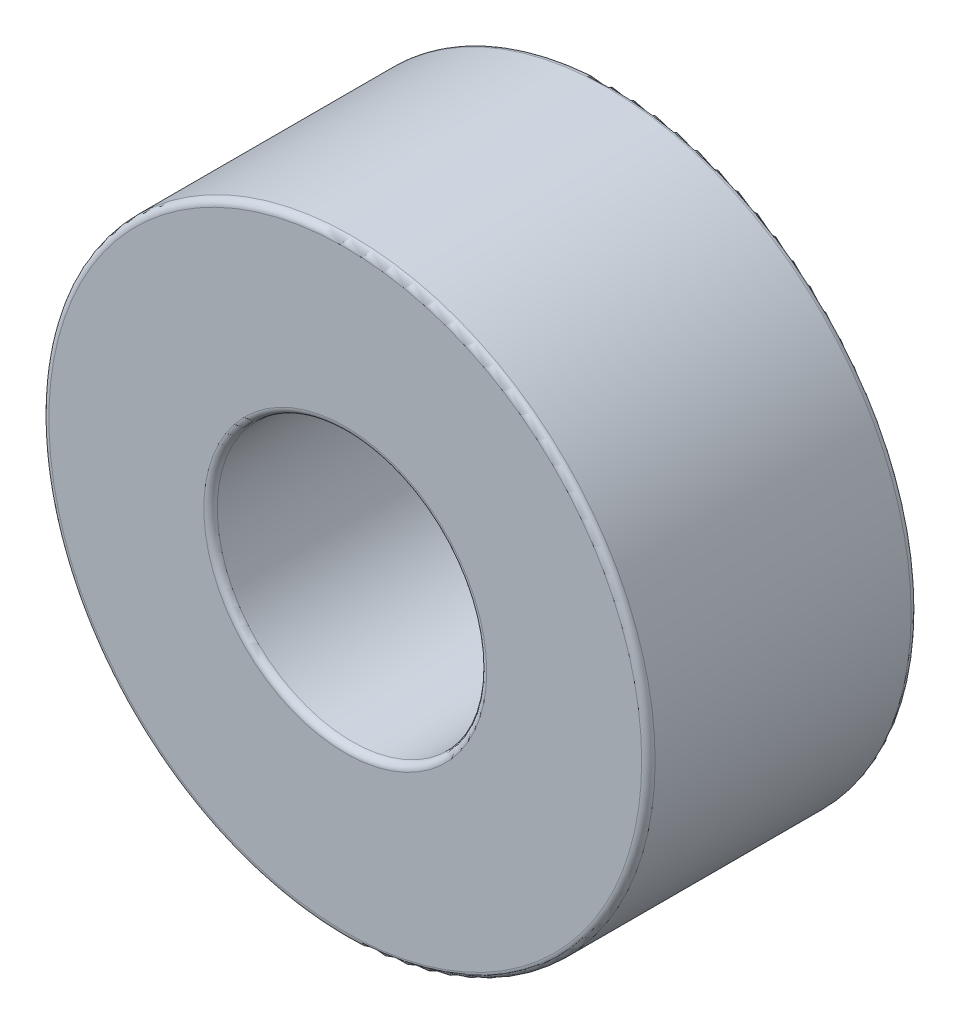
ISO-10303-21;
HEADER;
FILE_DESCRIPTION(('STEP AP214'),'2;1');
FILE_NAME('part.step','',(''),(''),'','','');
FILE_SCHEMA(('AUTOMOTIVE_DESIGN { 1 0 10303 214 1 1 1 1 }'));
ENDSEC;
DATA;
#1=APPLICATION_CONTEXT('core data for automotive mechanical design processes');
#2=APPLICATION_PROTOCOL_DEFINITION('international standard','automotive_design',2000,#1);
#3=PRODUCT_CONTEXT('',#1,'mechanical');
#4=PRODUCT('Part','Part','',(#3));
#5=PRODUCT_RELATED_PRODUCT_CATEGORY('part','',(#4));
#6=PRODUCT_DEFINITION_FORMATION('','',#4);
#7=PRODUCT_DEFINITION_CONTEXT('part definition',#1,'design');
#8=PRODUCT_DEFINITION('design','',#6,#7);
#9=PRODUCT_DEFINITION_SHAPE('','',#8);
#10=(LENGTH_UNIT() NAMED_UNIT(*) SI_UNIT(.MILLI.,.METRE.));
#11=(NAMED_UNIT(*) PLANE_ANGLE_UNIT() SI_UNIT($,.RADIAN.));
#12=(NAMED_UNIT(*) SI_UNIT($,.STERADIAN.) SOLID_ANGLE_UNIT());
#13=UNCERTAINTY_MEASURE_WITH_UNIT(LENGTH_MEASURE(1.E-05),#10,'distance_accuracy_value','');
#14=(GEOMETRIC_REPRESENTATION_CONTEXT(3) GLOBAL_UNCERTAINTY_ASSIGNED_CONTEXT((#13)) GLOBAL_UNIT_ASSIGNED_CONTEXT((#10,
#11,#12)) REPRESENTATION_CONTEXT('',''));
#15=CARTESIAN_POINT('',(0.,0.,0.));
#16=DIRECTION('',(0.,0.,1.));
#17=DIRECTION('',(1.,0.,0.));
#18=AXIS2_PLACEMENT_3D('',#15,#16,#17);
#19=CARTESIAN_POINT('',(0.,0.,4.));
#20=DIRECTION('',(0.,0.,1.));
#21=DIRECTION('',(1.,0.,0.));
#22=AXIS2_PLACEMENT_3D('',#19,#20,#21);
#23=PLANE('',#22);
#24=CARTESIAN_POINT('',(0.,0.,4.));
#25=DIRECTION('',(0.,0.,1.));
#26=DIRECTION('',(1.,0.,0.));
#27=AXIS2_PLACEMENT_3D('',#24,#25,#26);
#28=CIRCLE('',#27,2.1);
#29=CARTESIAN_POINT('',(2.1,0.,4.));
#30=VERTEX_POINT('',#29);
#31=EDGE_CURVE('E10',#30,#30,#28,.F.);
#32=ORIENTED_EDGE('',*,*,#31,.T.);
#33=EDGE_LOOP('',(#32));
#34=FACE_BOUND('',#33,.T.);
#35=CARTESIAN_POINT('',(0.,0.,4.));
#36=DIRECTION('',(0.,0.,1.));
#37=DIRECTION('',(1.,0.,0.));
#38=AXIS2_PLACEMENT_3D('',#35,#36,#37);
#39=CIRCLE('',#38,4.4);
#40=CARTESIAN_POINT('',(4.4,0.,4.));
#41=VERTEX_POINT('',#40);
#42=EDGE_CURVE('E38',#41,#41,#39,.T.);
#43=ORIENTED_EDGE('',*,*,#42,.T.);
#44=EDGE_LOOP('',(#43));
#45=FACE_BOUND('',#44,.T.);
#46=ADVANCED_FACE('F31',(#34,#45),#23,.T.);
#47=CARTESIAN_POINT('',(0.,0.,0.));
#48=DIRECTION('',(0.,0.,1.));
#49=DIRECTION('',(1.,0.,0.));
#50=AXIS2_PLACEMENT_3D('',#47,#48,#49);
#51=PLANE('',#50);
#52=CARTESIAN_POINT('',(0.,0.,0.));
#53=DIRECTION('',(0.,0.,1.));
#54=DIRECTION('',(1.,0.,0.));
#55=AXIS2_PLACEMENT_3D('',#52,#53,#54);
#56=CIRCLE('',#55,2.1);
#57=CARTESIAN_POINT('',(2.1,0.,0.));
#58=VERTEX_POINT('',#57);
#59=EDGE_CURVE('E57',#58,#58,#56,.T.);
#60=ORIENTED_EDGE('',*,*,#59,.T.);
#61=EDGE_LOOP('',(#60));
#62=FACE_BOUND('',#61,.T.);
#63=CARTESIAN_POINT('',(0.,0.,0.));
#64=DIRECTION('',(0.,0.,1.));
#65=DIRECTION('',(1.,0.,0.));
#66=AXIS2_PLACEMENT_3D('',#63,#64,#65);
#67=CIRCLE('',#66,4.4);
#68=CARTESIAN_POINT('',(4.4,0.,0.));
#69=VERTEX_POINT('',#68);
#70=EDGE_CURVE('E60',#69,#69,#67,.F.);
#71=ORIENTED_EDGE('',*,*,#70,.T.);
#72=EDGE_LOOP('',(#71));
#73=FACE_BOUND('',#72,.T.);
#74=ADVANCED_FACE('F64',(#62,#73),#51,.F.);
#75=CARTESIAN_POINT('',(0.,0.,4.));
#76=DIRECTION('',(0.,0.,-1.));
#77=DIRECTION('',(-1.,0.,0.));
#78=AXIS2_PLACEMENT_3D('',#75,#76,#77);
#79=CYLINDRICAL_SURFACE('',#78,4.5);
#80=CARTESIAN_POINT('',(0.,0.,0.0999999999999998));
#81=DIRECTION('',(0.,0.,1.));
#82=DIRECTION('',(1.,0.,0.));
#83=AXIS2_PLACEMENT_3D('',#80,#81,#82);
#84=CIRCLE('',#83,4.5);
#85=CARTESIAN_POINT('',(4.5,0.,0.0999999999999998));
#86=VERTEX_POINT('',#85);
#87=EDGE_CURVE('E42',#86,#86,#84,.T.);
#88=ORIENTED_EDGE('',*,*,#87,.T.);
#89=EDGE_LOOP('',(#88));
#90=FACE_BOUND('',#89,.T.);
#91=CARTESIAN_POINT('',(0.,0.,3.9));
#92=DIRECTION('',(0.,0.,1.));
#93=DIRECTION('',(1.,0.,0.));
#94=AXIS2_PLACEMENT_3D('',#91,#92,#93);
#95=CIRCLE('',#94,4.5);
#96=CARTESIAN_POINT('',(4.5,0.,3.9));
#97=VERTEX_POINT('',#96);
#98=EDGE_CURVE('E46',#97,#97,#95,.F.);
#99=ORIENTED_EDGE('',*,*,#98,.T.);
#100=EDGE_LOOP('',(#99));
#101=FACE_BOUND('',#100,.T.);
#102=ADVANCED_FACE('F74',(#90,#101),#79,.T.);
#103=CARTESIAN_POINT('',(0.,0.,4.));
#104=DIRECTION('',(0.,0.,-1.));
#105=DIRECTION('',(-1.,0.,0.));
#106=AXIS2_PLACEMENT_3D('',#103,#104,#105);
#107=CYLINDRICAL_SURFACE('',#106,2.);
#108=CARTESIAN_POINT('',(0.,0.,0.0999999999999998));
#109=DIRECTION('',(0.,0.,1.));
#110=DIRECTION('',(1.,0.,0.));
#111=AXIS2_PLACEMENT_3D('',#108,#109,#110);
#112=CIRCLE('',#111,2.);
#113=CARTESIAN_POINT('',(2.,0.,0.0999999999999998));
#114=VERTEX_POINT('',#113);
#115=EDGE_CURVE('E51',#114,#114,#112,.F.);
#116=ORIENTED_EDGE('',*,*,#115,.T.);
#117=EDGE_LOOP('',(#116));
#118=FACE_BOUND('',#117,.T.);
#119=CARTESIAN_POINT('',(0.,0.,3.9));
#120=DIRECTION('',(0.,0.,1.));
#121=DIRECTION('',(1.,0.,0.));
#122=AXIS2_PLACEMENT_3D('',#119,#120,#121);
#123=CIRCLE('',#122,2.);
#124=CARTESIAN_POINT('',(2.,0.,3.9));
#125=VERTEX_POINT('',#124);
#126=EDGE_CURVE('E54',#125,#125,#123,.T.);
#127=ORIENTED_EDGE('',*,*,#126,.T.);
#128=EDGE_LOOP('',(#127));
#129=FACE_BOUND('',#128,.T.);
#130=ADVANCED_FACE('F77',(#118,#129),#107,.F.);
#131=CARTESIAN_POINT('',(0.,0.,0.0999999999999998));
#132=DIRECTION('',(0.,0.,1.));
#133=DIRECTION('',(1.,0.,0.));
#134=AXIS2_PLACEMENT_3D('',#131,#132,#133);
#135=TOROIDAL_SURFACE('',#134,2.1,0.1);
#136=ORIENTED_EDGE('',*,*,#115,.F.);
#137=EDGE_LOOP('',(#136));
#138=FACE_BOUND('',#137,.T.);
#139=ORIENTED_EDGE('',*,*,#59,.F.);
#140=EDGE_LOOP('',(#139));
#141=FACE_BOUND('',#140,.T.);
#142=ADVANCED_FACE('F70',(#138,#141),#135,.T.);
#143=CARTESIAN_POINT('',(0.,0.,0.0999999999999998));
#144=DIRECTION('',(0.,0.,1.));
#145=DIRECTION('',(1.,0.,0.));
#146=AXIS2_PLACEMENT_3D('',#143,#144,#145);
#147=TOROIDAL_SURFACE('',#146,4.4,0.1);
#148=ORIENTED_EDGE('',*,*,#70,.F.);
#149=EDGE_LOOP('',(#148));
#150=FACE_BOUND('',#149,.T.);
#151=ORIENTED_EDGE('',*,*,#87,.F.);
#152=EDGE_LOOP('',(#151));
#153=FACE_BOUND('',#152,.T.);
#154=ADVANCED_FACE('F66',(#150,#153),#147,.T.);
#155=CARTESIAN_POINT('',(0.,0.,3.9));
#156=DIRECTION('',(0.,0.,1.));
#157=DIRECTION('',(1.,0.,0.));
#158=AXIS2_PLACEMENT_3D('',#155,#156,#157);
#159=TOROIDAL_SURFACE('',#158,2.1,0.1);
#160=ORIENTED_EDGE('',*,*,#31,.F.);
#161=EDGE_LOOP('',(#160));
#162=FACE_BOUND('',#161,.T.);
#163=ORIENTED_EDGE('',*,*,#126,.F.);
#164=EDGE_LOOP('',(#163));
#165=FACE_BOUND('',#164,.T.);
#166=ADVANCED_FACE('F69',(#162,#165),#159,.T.);
#167=CARTESIAN_POINT('',(0.,0.,3.9));
#168=DIRECTION('',(0.,0.,1.));
#169=DIRECTION('',(1.,0.,0.));
#170=AXIS2_PLACEMENT_3D('',#167,#168,#169);
#171=TOROIDAL_SURFACE('',#170,4.4,0.1);
#172=ORIENTED_EDGE('',*,*,#98,.F.);
#173=EDGE_LOOP('',(#172));
#174=FACE_BOUND('',#173,.T.);
#175=ORIENTED_EDGE('',*,*,#42,.F.);
#176=EDGE_LOOP('',(#175));
#177=FACE_BOUND('',#176,.T.);
#178=ADVANCED_FACE('F33',(#174,#177),#171,.T.);
#179=CLOSED_SHELL('',(#46,#74,#102,#130,#142,#154,#166,#178));
#180=MANIFOLD_SOLID_BREP('B2',#179);
#181=ADVANCED_BREP_SHAPE_REPRESENTATION('',(#18,#180),#14);
#182=SHAPE_DEFINITION_REPRESENTATION(#9,#181);
ENDSEC;
END-ISO-10303-21;
